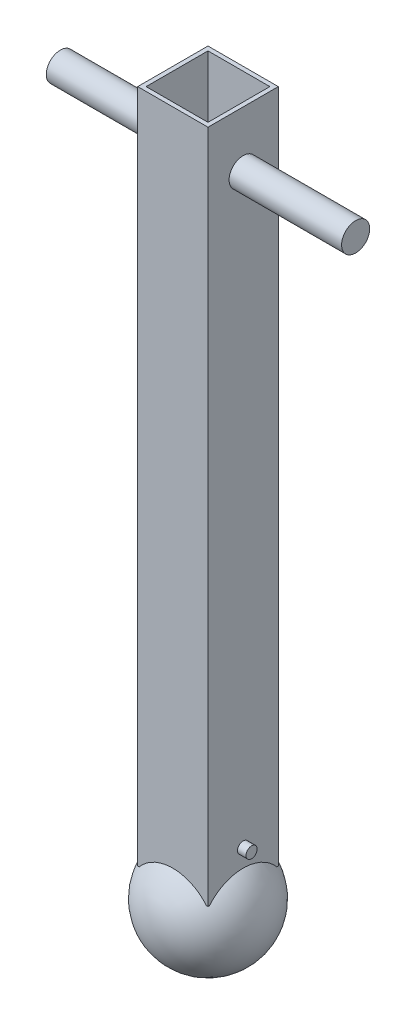
ISO-10303-21;
HEADER;
FILE_DESCRIPTION(('STEP AP214'),'2;1');
FILE_NAME('part.step','',(''),(''),'','','');
FILE_SCHEMA(('AUTOMOTIVE_DESIGN { 1 0 10303 214 1 1 1 1 }'));
ENDSEC;
DATA;
#1=APPLICATION_CONTEXT('core data for automotive mechanical design processes');
#2=APPLICATION_PROTOCOL_DEFINITION('international standard','automotive_design',2000,#1);
#3=PRODUCT_CONTEXT('',#1,'mechanical');
#4=PRODUCT('Part','Part','',(#3));
#5=PRODUCT_RELATED_PRODUCT_CATEGORY('part','',(#4));
#6=PRODUCT_DEFINITION_FORMATION('','',#4);
#7=PRODUCT_DEFINITION_CONTEXT('part definition',#1,'design');
#8=PRODUCT_DEFINITION('design','',#6,#7);
#9=PRODUCT_DEFINITION_SHAPE('','',#8);
#10=(LENGTH_UNIT() NAMED_UNIT(*) SI_UNIT(.MILLI.,.METRE.));
#11=(NAMED_UNIT(*) PLANE_ANGLE_UNIT() SI_UNIT($,.RADIAN.));
#12=(NAMED_UNIT(*) SI_UNIT($,.STERADIAN.) SOLID_ANGLE_UNIT());
#13=UNCERTAINTY_MEASURE_WITH_UNIT(LENGTH_MEASURE(1.E-05),#10,'distance_accuracy_value','');
#14=(GEOMETRIC_REPRESENTATION_CONTEXT(3) GLOBAL_UNCERTAINTY_ASSIGNED_CONTEXT((#13)) GLOBAL_UNIT_ASSIGNED_CONTEXT((#10,
#11,#12)) REPRESENTATION_CONTEXT('',''));
#15=CARTESIAN_POINT('',(0.,0.,0.));
#16=DIRECTION('',(0.,0.,1.));
#17=DIRECTION('',(1.,0.,0.));
#18=AXIS2_PLACEMENT_3D('',#15,#16,#17);
#19=CARTESIAN_POINT('',(15.5,12.,0.));
#20=DIRECTION('',(-1.,0.,0.));
#21=DIRECTION('',(0.,0.,1.));
#22=AXIS2_PLACEMENT_3D('',#19,#20,#21);
#23=CYLINDRICAL_SURFACE('',#22,1.99);
#24=CARTESIAN_POINT('',(15.5,12.,0.));
#25=DIRECTION('',(-1.,0.,0.));
#26=DIRECTION('',(0.,0.,1.));
#27=AXIS2_PLACEMENT_3D('',#24,#25,#26);
#28=CIRCLE('',#27,1.99);
#29=CARTESIAN_POINT('',(15.5,12.,1.99));
#30=VERTEX_POINT('',#29);
#31=EDGE_CURVE('E11',#30,#30,#28,.T.);
#32=ORIENTED_EDGE('',*,*,#31,.T.);
#33=EDGE_LOOP('',(#32));
#34=FACE_BOUND('',#33,.T.);
#35=CARTESIAN_POINT('',(-15.5,12.,0.));
#36=DIRECTION('',(-1.,0.,0.));
#37=DIRECTION('',(0.,0.,1.));
#38=AXIS2_PLACEMENT_3D('',#35,#36,#37);
#39=CIRCLE('',#38,1.99);
#40=CARTESIAN_POINT('',(-15.5,12.,1.99));
#41=VERTEX_POINT('',#40);
#42=EDGE_CURVE('E49',#41,#41,#39,.T.);
#43=ORIENTED_EDGE('',*,*,#42,.F.);
#44=EDGE_LOOP('',(#43));
#45=FACE_BOUND('',#44,.T.);
#46=ADVANCED_FACE('F43',(#34,#45),#23,.T.);
#47=CARTESIAN_POINT('',(15.5,12.,0.));
#48=DIRECTION('',(-1.,0.,0.));
#49=DIRECTION('',(0.,0.,1.));
#50=AXIS2_PLACEMENT_3D('',#47,#48,#49);
#51=PLANE('',#50);
#52=ORIENTED_EDGE('',*,*,#31,.F.);
#53=EDGE_LOOP('',(#52));
#54=FACE_BOUND('',#53,.T.);
#55=ADVANCED_FACE('F58',(#54),#51,.F.);
#56=CARTESIAN_POINT('',(-15.5,12.,0.));
#57=DIRECTION('',(-1.,0.,0.));
#58=DIRECTION('',(0.,0.,1.));
#59=AXIS2_PLACEMENT_3D('',#56,#57,#58);
#60=PLANE('',#59);
#61=ORIENTED_EDGE('',*,*,#42,.T.);
#62=EDGE_LOOP('',(#61));
#63=FACE_BOUND('',#62,.T.);
#64=ADVANCED_FACE('F55',(#63),#60,.T.);
#65=CLOSED_SHELL('',(#46,#55,#64));
#66=MANIFOLD_SOLID_BREP('B2',#65);
#67=CARTESIAN_POINT('',(0.,0.,0.));
#68=DIRECTION('',(0.,1.,0.));
#69=DIRECTION('',(0.,0.,1.));
#70=AXIS2_PLACEMENT_3D('',#67,#68,#69);
#71=PLANE('',#70);
#72=DIRECTION('',(1.,0.,0.));
#73=VECTOR('',#72,1.);
#74=CARTESIAN_POINT('',(-12.5,0.,12.5));
#75=LINE('',#74,#73);
#76=CARTESIAN_POINT('',(11.9895788082818,0.,12.5));
#77=VERTEX_POINT('',#76);
#78=CARTESIAN_POINT('',(12.5,0.,12.5));
#79=VERTEX_POINT('',#78);
#80=EDGE_CURVE('E241',#77,#79,#75,.T.);
#81=ORIENTED_EDGE('',*,*,#80,.F.);
#82=CARTESIAN_POINT('',(0.,0.,0.));
#83=DIRECTION('',(0.,1.,0.));
#84=DIRECTION('',(0.,0.,1.));
#85=AXIS2_PLACEMENT_3D('',#82,#83,#84);
#86=CIRCLE('',#85,17.3205080756888);
#87=CARTESIAN_POINT('',(12.5,0.,11.9895788082818));
#88=VERTEX_POINT('',#87);
#89=EDGE_CURVE('E207',#77,#88,#86,.T.);
#90=ORIENTED_EDGE('',*,*,#89,.T.);
#91=DIRECTION('',(0.,0.,-1.));
#92=VECTOR('',#91,1.);
#93=CARTESIAN_POINT('',(12.5,0.,-12.5));
#94=LINE('',#93,#92);
#95=EDGE_CURVE('E230',#79,#88,#94,.T.);
#96=ORIENTED_EDGE('',*,*,#95,.F.);
#97=EDGE_LOOP('',(#81,#90,#96));
#98=FACE_BOUND('',#97,.T.);
#99=ADVANCED_FACE('F87',(#98),#71,.F.);
#100=CARTESIAN_POINT('',(12.5,0.,-11.9895788082818));
#101=VERTEX_POINT('',#100);
#102=CARTESIAN_POINT('',(12.5,0.,-12.5));
#103=VERTEX_POINT('',#102);
#104=EDGE_CURVE('E218',#101,#103,#94,.T.);
#105=ORIENTED_EDGE('',*,*,#104,.F.);
#106=CARTESIAN_POINT('',(11.9895788082818,0.,-12.5));
#107=VERTEX_POINT('',#106);
#108=EDGE_CURVE('E200',#101,#107,#86,.T.);
#109=ORIENTED_EDGE('',*,*,#108,.T.);
#110=DIRECTION('',(-1.,0.,0.));
#111=VECTOR('',#110,1.);
#112=CARTESIAN_POINT('',(-12.5,0.,-12.5));
#113=LINE('',#112,#111);
#114=EDGE_CURVE('E234',#103,#107,#113,.T.);
#115=ORIENTED_EDGE('',*,*,#114,.F.);
#116=EDGE_LOOP('',(#105,#109,#115));
#117=FACE_BOUND('',#116,.T.);
#118=ADVANCED_FACE('F339',(#117),#71,.F.);
#119=CARTESIAN_POINT('',(-11.9895788082818,0.,-12.5));
#120=VERTEX_POINT('',#119);
#121=CARTESIAN_POINT('',(-12.5,0.,-12.5));
#122=VERTEX_POINT('',#121);
#123=EDGE_CURVE('E233',#120,#122,#113,.T.);
#124=ORIENTED_EDGE('',*,*,#123,.F.);
#125=CARTESIAN_POINT('',(-12.5,0.,-11.9895788082818));
#126=VERTEX_POINT('',#125);
#127=EDGE_CURVE('E274',#120,#126,#86,.T.);
#128=ORIENTED_EDGE('',*,*,#127,.T.);
#129=DIRECTION('',(0.,0.,1.));
#130=VECTOR('',#129,1.);
#131=CARTESIAN_POINT('',(-12.5,0.,-12.5));
#132=LINE('',#131,#130);
#133=EDGE_CURVE('E238',#122,#126,#132,.T.);
#134=ORIENTED_EDGE('',*,*,#133,.F.);
#135=EDGE_LOOP('',(#124,#128,#134));
#136=FACE_BOUND('',#135,.T.);
#137=ADVANCED_FACE('F324',(#136),#71,.F.);
#138=CARTESIAN_POINT('',(12.5,240.,-12.5));
#139=DIRECTION('',(-1.,0.,0.));
#140=DIRECTION('',(0.,0.,1.));
#141=AXIS2_PLACEMENT_3D('',#138,#139,#140);
#142=PLANE('',#141);
#143=CARTESIAN_POINT('',(12.5,220.,0.));
#144=DIRECTION('',(-1.,0.,0.));
#145=DIRECTION('',(0.,0.,1.));
#146=AXIS2_PLACEMENT_3D('',#143,#144,#145);
#147=CIRCLE('',#146,5.00000000000002);
#148=CARTESIAN_POINT('',(12.5,220.,5.));
#149=VERTEX_POINT('',#148);
#150=EDGE_CURVE('E267',#149,#149,#147,.T.);
#151=ORIENTED_EDGE('',*,*,#150,.T.);
#152=EDGE_LOOP('',(#151));
#153=FACE_BOUND('',#152,.T.);
#154=CARTESIAN_POINT('',(12.5,12.,0.));
#155=DIRECTION('',(1.,0.,0.));
#156=DIRECTION('',(0.,0.,-1.));
#157=AXIS2_PLACEMENT_3D('',#154,#155,#156);
#158=CIRCLE('',#157,2.);
#159=CARTESIAN_POINT('',(12.5,12.,-2.));
#160=VERTEX_POINT('',#159);
#161=EDGE_CURVE('E262',#160,#160,#158,.T.);
#162=ORIENTED_EDGE('',*,*,#161,.F.);
#163=EDGE_LOOP('',(#162));
#164=FACE_BOUND('',#163,.T.);
#165=ORIENTED_EDGE('',*,*,#95,.T.);
#166=CARTESIAN_POINT('',(12.5,-10.,0.));
#167=DIRECTION('',(-1.,0.,0.));
#168=DIRECTION('',(0.,0.,1.));
#169=AXIS2_PLACEMENT_3D('',#166,#167,#168);
#170=CIRCLE('',#169,15.612494995996);
#171=EDGE_CURVE('E205',#88,#101,#170,.T.);
#172=ORIENTED_EDGE('',*,*,#171,.T.);
#173=ORIENTED_EDGE('',*,*,#104,.T.);
#174=DIRECTION('',(0.,-1.,0.));
#175=VECTOR('',#174,1.);
#176=CARTESIAN_POINT('',(12.5,240.,-12.5));
#177=LINE('',#176,#175);
#178=CARTESIAN_POINT('',(12.5,240.,-12.5));
#179=VERTEX_POINT('',#178);
#180=EDGE_CURVE('E96',#179,#103,#177,.T.);
#181=ORIENTED_EDGE('',*,*,#180,.F.);
#182=DIRECTION('',(0.,0.,-1.));
#183=VECTOR('',#182,1.);
#184=CARTESIAN_POINT('',(12.5,240.,-12.5));
#185=LINE('',#184,#183);
#186=CARTESIAN_POINT('',(12.5,240.,12.5));
#187=VERTEX_POINT('',#186);
#188=EDGE_CURVE('E219',#187,#179,#185,.T.);
#189=ORIENTED_EDGE('',*,*,#188,.F.);
#190=DIRECTION('',(0.,-1.,0.));
#191=VECTOR('',#190,1.);
#192=CARTESIAN_POINT('',(12.5,240.,12.5));
#193=LINE('',#192,#191);
#194=EDGE_CURVE('E229',#187,#79,#193,.T.);
#195=ORIENTED_EDGE('',*,*,#194,.T.);
#196=EDGE_LOOP('',(#165,#172,#173,#181,#189,#195));
#197=FACE_BOUND('',#196,.T.);
#198=ADVANCED_FACE('F89',(#153,#164,#197),#142,.F.);
#199=CARTESIAN_POINT('',(-12.5,240.,-12.5));
#200=DIRECTION('',(0.,0.,1.));
#201=DIRECTION('',(1.,0.,0.));
#202=AXIS2_PLACEMENT_3D('',#199,#200,#201);
#203=PLANE('',#202);
#204=ORIENTED_EDGE('',*,*,#114,.T.);
#205=CARTESIAN_POINT('',(0.,-10.,-12.5));
#206=DIRECTION('',(0.,0.,1.));
#207=DIRECTION('',(1.,0.,0.));
#208=AXIS2_PLACEMENT_3D('',#205,#206,#207);
#209=CIRCLE('',#208,15.612494995996);
#210=EDGE_CURVE('E279',#107,#120,#209,.T.);
#211=ORIENTED_EDGE('',*,*,#210,.T.);
#212=ORIENTED_EDGE('',*,*,#123,.T.);
#213=DIRECTION('',(0.,-1.,0.));
#214=VECTOR('',#213,1.);
#215=CARTESIAN_POINT('',(-12.5,240.,-12.5));
#216=LINE('',#215,#214);
#217=CARTESIAN_POINT('',(-12.5,240.,-12.5));
#218=VERTEX_POINT('',#217);
#219=EDGE_CURVE('E249',#218,#122,#216,.T.);
#220=ORIENTED_EDGE('',*,*,#219,.F.);
#221=DIRECTION('',(-1.,0.,0.));
#222=VECTOR('',#221,1.);
#223=CARTESIAN_POINT('',(-12.5,240.,-12.5));
#224=LINE('',#223,#222);
#225=EDGE_CURVE('E222',#179,#218,#224,.T.);
#226=ORIENTED_EDGE('',*,*,#225,.F.);
#227=ORIENTED_EDGE('',*,*,#180,.T.);
#228=EDGE_LOOP('',(#204,#211,#212,#220,#226,#227));
#229=FACE_BOUND('',#228,.T.);
#230=ADVANCED_FACE('F308',(#229),#203,.F.);
#231=CARTESIAN_POINT('',(-12.5,240.,-12.5));
#232=DIRECTION('',(1.,0.,0.));
#233=DIRECTION('',(0.,0.,-1.));
#234=AXIS2_PLACEMENT_3D('',#231,#232,#233);
#235=PLANE('',#234);
#236=CARTESIAN_POINT('',(-12.5,220.,0.));
#237=DIRECTION('',(1.,0.,0.));
#238=DIRECTION('',(0.,0.,-1.));
#239=AXIS2_PLACEMENT_3D('',#236,#237,#238);
#240=CIRCLE('',#239,5.00000000000002);
#241=CARTESIAN_POINT('',(-12.5,220.,-5.00000000000003));
#242=VERTEX_POINT('',#241);
#243=EDGE_CURVE('E399',#242,#242,#240,.T.);
#244=ORIENTED_EDGE('',*,*,#243,.T.);
#245=EDGE_LOOP('',(#244));
#246=FACE_BOUND('',#245,.T.);
#247=CARTESIAN_POINT('',(-12.5,12.,0.));
#248=DIRECTION('',(1.,0.,0.));
#249=DIRECTION('',(0.,0.,-1.));
#250=AXIS2_PLACEMENT_3D('',#247,#248,#249);
#251=CIRCLE('',#250,2.);
#252=CARTESIAN_POINT('',(-12.5,12.,-2.));
#253=VERTEX_POINT('',#252);
#254=EDGE_CURVE('E256',#253,#253,#251,.T.);
#255=ORIENTED_EDGE('',*,*,#254,.T.);
#256=EDGE_LOOP('',(#255));
#257=FACE_BOUND('',#256,.T.);
#258=ORIENTED_EDGE('',*,*,#133,.T.);
#259=CARTESIAN_POINT('',(-12.5,-10.,0.));
#260=DIRECTION('',(1.,0.,0.));
#261=DIRECTION('',(0.,0.,-1.));
#262=AXIS2_PLACEMENT_3D('',#259,#260,#261);
#263=CIRCLE('',#262,15.612494995996);
#264=CARTESIAN_POINT('',(-12.5,0.,11.9895788082818));
#265=VERTEX_POINT('',#264);
#266=EDGE_CURVE('E276',#126,#265,#263,.T.);
#267=ORIENTED_EDGE('',*,*,#266,.T.);
#268=CARTESIAN_POINT('',(-12.5,0.,12.5));
#269=VERTEX_POINT('',#268);
#270=EDGE_CURVE('E237',#265,#269,#132,.T.);
#271=ORIENTED_EDGE('',*,*,#270,.T.);
#272=DIRECTION('',(0.,-1.,0.));
#273=VECTOR('',#272,1.);
#274=CARTESIAN_POINT('',(-12.5,240.,12.5));
#275=LINE('',#274,#273);
#276=CARTESIAN_POINT('',(-12.5,240.,12.5));
#277=VERTEX_POINT('',#276);
#278=EDGE_CURVE('E246',#277,#269,#275,.T.);
#279=ORIENTED_EDGE('',*,*,#278,.F.);
#280=DIRECTION('',(0.,0.,1.));
#281=VECTOR('',#280,1.);
#282=CARTESIAN_POINT('',(-12.5,240.,-12.5));
#283=LINE('',#282,#281);
#284=EDGE_CURVE('E225',#218,#277,#283,.T.);
#285=ORIENTED_EDGE('',*,*,#284,.F.);
#286=ORIENTED_EDGE('',*,*,#219,.T.);
#287=EDGE_LOOP('',(#258,#267,#271,#279,#285,#286));
#288=FACE_BOUND('',#287,.T.);
#289=ADVANCED_FACE('F314',(#246,#257,#288),#235,.F.);
#290=CARTESIAN_POINT('',(-12.5,240.,12.5));
#291=DIRECTION('',(0.,0.,-1.));
#292=DIRECTION('',(-1.,0.,0.));
#293=AXIS2_PLACEMENT_3D('',#290,#291,#292);
#294=PLANE('',#293);
#295=CARTESIAN_POINT('',(-11.9895788082818,0.,12.5));
#296=VERTEX_POINT('',#295);
#297=EDGE_CURVE('E223',#269,#296,#75,.T.);
#298=ORIENTED_EDGE('',*,*,#297,.T.);
#299=CARTESIAN_POINT('',(0.,-10.,12.5));
#300=DIRECTION('',(0.,0.,-1.));
#301=DIRECTION('',(-1.,0.,0.));
#302=AXIS2_PLACEMENT_3D('',#299,#300,#301);
#303=CIRCLE('',#302,15.612494995996);
#304=EDGE_CURVE('E107',#296,#77,#303,.T.);
#305=ORIENTED_EDGE('',*,*,#304,.T.);
#306=ORIENTED_EDGE('',*,*,#80,.T.);
#307=ORIENTED_EDGE('',*,*,#194,.F.);
#308=DIRECTION('',(1.,0.,0.));
#309=VECTOR('',#308,1.);
#310=CARTESIAN_POINT('',(-12.5,240.,12.5));
#311=LINE('',#310,#309);
#312=EDGE_CURVE('E227',#277,#187,#311,.T.);
#313=ORIENTED_EDGE('',*,*,#312,.F.);
#314=ORIENTED_EDGE('',*,*,#278,.T.);
#315=EDGE_LOOP('',(#298,#305,#306,#307,#313,#314));
#316=FACE_BOUND('',#315,.T.);
#317=ADVANCED_FACE('F297',(#316),#294,.F.);
#318=CARTESIAN_POINT('',(0.,240.,0.));
#319=DIRECTION('',(0.,1.,0.));
#320=DIRECTION('',(0.,0.,1.));
#321=AXIS2_PLACEMENT_3D('',#318,#319,#320);
#322=PLANE('',#321);
#323=DIRECTION('',(0.,0.,-1.));
#324=VECTOR('',#323,1.);
#325=CARTESIAN_POINT('',(11.,240.,0.));
#326=LINE('',#325,#324);
#327=CARTESIAN_POINT('',(11.,240.,11.));
#328=VERTEX_POINT('',#327);
#329=CARTESIAN_POINT('',(11.,240.,-11.));
#330=VERTEX_POINT('',#329);
#331=EDGE_CURVE('E216',#328,#330,#326,.T.);
#332=ORIENTED_EDGE('',*,*,#331,.F.);
#333=DIRECTION('',(1.,0.,0.));
#334=VECTOR('',#333,1.);
#335=CARTESIAN_POINT('',(0.,240.,11.));
#336=LINE('',#335,#334);
#337=CARTESIAN_POINT('',(-11.,240.,11.));
#338=VERTEX_POINT('',#337);
#339=EDGE_CURVE('E198',#338,#328,#336,.T.);
#340=ORIENTED_EDGE('',*,*,#339,.F.);
#341=DIRECTION('',(0.,0.,1.));
#342=VECTOR('',#341,1.);
#343=CARTESIAN_POINT('',(-11.,240.,0.));
#344=LINE('',#343,#342);
#345=CARTESIAN_POINT('',(-11.,240.,-11.));
#346=VERTEX_POINT('',#345);
#347=EDGE_CURVE('E211',#346,#338,#344,.T.);
#348=ORIENTED_EDGE('',*,*,#347,.F.);
#349=DIRECTION('',(-1.,0.,0.));
#350=VECTOR('',#349,1.);
#351=CARTESIAN_POINT('',(0.,240.,-11.));
#352=LINE('',#351,#350);
#353=EDGE_CURVE('E214',#330,#346,#352,.T.);
#354=ORIENTED_EDGE('',*,*,#353,.F.);
#355=EDGE_LOOP('',(#332,#340,#348,#354));
#356=FACE_BOUND('',#355,.T.);
#357=ORIENTED_EDGE('',*,*,#188,.T.);
#358=ORIENTED_EDGE('',*,*,#225,.T.);
#359=ORIENTED_EDGE('',*,*,#284,.T.);
#360=ORIENTED_EDGE('',*,*,#312,.T.);
#361=EDGE_LOOP('',(#357,#358,#359,#360));
#362=FACE_BOUND('',#361,.T.);
#363=ADVANCED_FACE('F293',(#356,#362),#322,.T.);
#364=ORIENTED_EDGE('',*,*,#270,.F.);
#365=EDGE_CURVE('E193',#265,#296,#86,.T.);
#366=ORIENTED_EDGE('',*,*,#365,.T.);
#367=ORIENTED_EDGE('',*,*,#297,.F.);
#368=EDGE_LOOP('',(#364,#366,#367));
#369=FACE_BOUND('',#368,.T.);
#370=ADVANCED_FACE('F296',(#369),#71,.F.);
#371=CARTESIAN_POINT('',(11.,300.,11.));
#372=DIRECTION('',(1.,0.,0.));
#373=DIRECTION('',(0.,0.,-1.));
#374=AXIS2_PLACEMENT_3D('',#371,#372,#373);
#375=PLANE('',#374);
#376=CARTESIAN_POINT('',(11.,220.,0.));
#377=DIRECTION('',(1.,0.,0.));
#378=DIRECTION('',(0.,0.,-1.));
#379=AXIS2_PLACEMENT_3D('',#376,#377,#378);
#380=CIRCLE('',#379,5.00000000000002);
#381=CARTESIAN_POINT('',(11.,220.,-5.00000000000003));
#382=VERTEX_POINT('',#381);
#383=EDGE_CURVE('E397',#382,#382,#380,.T.);
#384=ORIENTED_EDGE('',*,*,#383,.T.);
#385=EDGE_LOOP('',(#384));
#386=FACE_BOUND('',#385,.T.);
#387=CARTESIAN_POINT('',(11.,12.,0.));
#388=DIRECTION('',(1.,0.,0.));
#389=DIRECTION('',(0.,0.,-1.));
#390=AXIS2_PLACEMENT_3D('',#387,#388,#389);
#391=CIRCLE('',#390,2.);
#392=CARTESIAN_POINT('',(11.,12.,-2.));
#393=VERTEX_POINT('',#392);
#394=EDGE_CURVE('E255',#393,#393,#391,.T.);
#395=ORIENTED_EDGE('',*,*,#394,.T.);
#396=EDGE_LOOP('',(#395));
#397=FACE_BOUND('',#396,.T.);
#398=DIRECTION('',(0.,-1.,0.));
#399=VECTOR('',#398,1.);
#400=CARTESIAN_POINT('',(11.,300.,-11.));
#401=LINE('',#400,#399);
#402=CARTESIAN_POINT('',(11.,2.56980508997654,-11.));
#403=VERTEX_POINT('',#402);
#404=EDGE_CURVE('E192',#330,#403,#401,.T.);
#405=ORIENTED_EDGE('',*,*,#404,.T.);
#406=CARTESIAN_POINT('',(11.,-10.,0.));
#407=DIRECTION('',(1.,0.,0.));
#408=DIRECTION('',(0.,0.,-1.));
#409=AXIS2_PLACEMENT_3D('',#406,#407,#408);
#410=CIRCLE('',#409,16.7032930884901);
#411=CARTESIAN_POINT('',(11.,2.56980508997654,11.));
#412=VERTEX_POINT('',#411);
#413=EDGE_CURVE('E178',#403,#412,#410,.T.);
#414=ORIENTED_EDGE('',*,*,#413,.T.);
#415=DIRECTION('',(0.,-1.,0.));
#416=VECTOR('',#415,1.);
#417=CARTESIAN_POINT('',(11.,300.,11.));
#418=LINE('',#417,#416);
#419=EDGE_CURVE('E189',#328,#412,#418,.T.);
#420=ORIENTED_EDGE('',*,*,#419,.F.);
#421=ORIENTED_EDGE('',*,*,#331,.T.);
#422=EDGE_LOOP('',(#405,#414,#420,#421));
#423=FACE_BOUND('',#422,.T.);
#424=ADVANCED_FACE('F188',(#386,#397,#423),#375,.F.);
#425=CARTESIAN_POINT('',(-11.,300.,-11.));
#426=DIRECTION('',(0.,0.,-1.));
#427=DIRECTION('',(-1.,0.,0.));
#428=AXIS2_PLACEMENT_3D('',#425,#426,#427);
#429=PLANE('',#428);
#430=DIRECTION('',(0.,-1.,0.));
#431=VECTOR('',#430,1.);
#432=CARTESIAN_POINT('',(-11.,300.,-11.));
#433=LINE('',#432,#431);
#434=CARTESIAN_POINT('',(-11.,2.56980508997654,-11.));
#435=VERTEX_POINT('',#434);
#436=EDGE_CURVE('E202',#346,#435,#433,.T.);
#437=ORIENTED_EDGE('',*,*,#436,.T.);
#438=CARTESIAN_POINT('',(0.,-10.,-11.));
#439=DIRECTION('',(0.,0.,-1.));
#440=DIRECTION('',(-1.,0.,0.));
#441=AXIS2_PLACEMENT_3D('',#438,#439,#440);
#442=CIRCLE('',#441,16.7032930884901);
#443=EDGE_CURVE('E194',#435,#403,#442,.T.);
#444=ORIENTED_EDGE('',*,*,#443,.T.);
#445=ORIENTED_EDGE('',*,*,#404,.F.);
#446=ORIENTED_EDGE('',*,*,#353,.T.);
#447=EDGE_LOOP('',(#437,#444,#445,#446));
#448=FACE_BOUND('',#447,.T.);
#449=ADVANCED_FACE('F287',(#448),#429,.F.);
#450=CARTESIAN_POINT('',(-11.,300.,11.));
#451=DIRECTION('',(-1.,0.,0.));
#452=DIRECTION('',(0.,0.,1.));
#453=AXIS2_PLACEMENT_3D('',#450,#451,#452);
#454=PLANE('',#453);
#455=CARTESIAN_POINT('',(-11.,220.,0.));
#456=DIRECTION('',(-1.,0.,0.));
#457=DIRECTION('',(0.,0.,1.));
#458=AXIS2_PLACEMENT_3D('',#455,#456,#457);
#459=CIRCLE('',#458,5.00000000000002);
#460=CARTESIAN_POINT('',(-11.,220.,5.));
#461=VERTEX_POINT('',#460);
#462=EDGE_CURVE('E91',#461,#461,#459,.T.);
#463=ORIENTED_EDGE('',*,*,#462,.T.);
#464=EDGE_LOOP('',(#463));
#465=FACE_BOUND('',#464,.T.);
#466=CARTESIAN_POINT('',(-11.,12.,0.));
#467=DIRECTION('',(-1.,0.,0.));
#468=DIRECTION('',(0.,0.,1.));
#469=AXIS2_PLACEMENT_3D('',#466,#467,#468);
#470=CIRCLE('',#469,2.);
#471=CARTESIAN_POINT('',(-11.,12.,2.));
#472=VERTEX_POINT('',#471);
#473=EDGE_CURVE('E253',#472,#472,#470,.T.);
#474=ORIENTED_EDGE('',*,*,#473,.T.);
#475=EDGE_LOOP('',(#474));
#476=FACE_BOUND('',#475,.T.);
#477=DIRECTION('',(0.,-1.,0.));
#478=VECTOR('',#477,1.);
#479=CARTESIAN_POINT('',(-11.,300.,11.));
#480=LINE('',#479,#478);
#481=CARTESIAN_POINT('',(-11.,2.56980508997653,11.));
#482=VERTEX_POINT('',#481);
#483=EDGE_CURVE('E199',#338,#482,#480,.T.);
#484=ORIENTED_EDGE('',*,*,#483,.T.);
#485=CARTESIAN_POINT('',(-11.,-10.,0.));
#486=DIRECTION('',(-1.,0.,0.));
#487=DIRECTION('',(0.,0.,1.));
#488=AXIS2_PLACEMENT_3D('',#485,#486,#487);
#489=CIRCLE('',#488,16.7032930884901);
#490=EDGE_CURVE('E181',#482,#435,#489,.T.);
#491=ORIENTED_EDGE('',*,*,#490,.T.);
#492=ORIENTED_EDGE('',*,*,#436,.F.);
#493=ORIENTED_EDGE('',*,*,#347,.T.);
#494=EDGE_LOOP('',(#484,#491,#492,#493));
#495=FACE_BOUND('',#494,.T.);
#496=ADVANCED_FACE('F291',(#465,#476,#495),#454,.F.);
#497=CARTESIAN_POINT('',(-11.,300.,11.));
#498=DIRECTION('',(0.,0.,1.));
#499=DIRECTION('',(1.,0.,0.));
#500=AXIS2_PLACEMENT_3D('',#497,#498,#499);
#501=PLANE('',#500);
#502=ORIENTED_EDGE('',*,*,#419,.T.);
#503=CARTESIAN_POINT('',(0.,-10.,11.));
#504=DIRECTION('',(0.,0.,1.));
#505=DIRECTION('',(1.,0.,0.));
#506=AXIS2_PLACEMENT_3D('',#503,#504,#505);
#507=CIRCLE('',#506,16.7032930884901);
#508=EDGE_CURVE('E41',#412,#482,#507,.T.);
#509=ORIENTED_EDGE('',*,*,#508,.T.);
#510=ORIENTED_EDGE('',*,*,#483,.F.);
#511=ORIENTED_EDGE('',*,*,#339,.T.);
#512=EDGE_LOOP('',(#502,#509,#510,#511));
#513=FACE_BOUND('',#512,.T.);
#514=ADVANCED_FACE('F196',(#513),#501,.F.);
#515=CARTESIAN_POINT('',(0.,-10.,0.));
#516=DIRECTION('',(0.,0.,-1.));
#517=DIRECTION('',(-1.,0.,0.));
#518=AXIS2_PLACEMENT_3D('',#515,#516,#517);
#519=SPHERICAL_SURFACE('',#518,20.);
#520=CARTESIAN_POINT('',(0.,10.,0.));
#521=VERTEX_POINT('',#520);
#522=VERTEX_LOOP('',#521);
#523=FACE_BOUND('',#522,.T.);
#524=ORIENTED_EDGE('',*,*,#413,.F.);
#525=ORIENTED_EDGE('',*,*,#443,.F.);
#526=ORIENTED_EDGE('',*,*,#490,.F.);
#527=ORIENTED_EDGE('',*,*,#508,.F.);
#528=EDGE_LOOP('',(#524,#525,#526,#527));
#529=FACE_BOUND('',#528,.T.);
#530=ADVANCED_FACE('F177',(#523,#529),#519,.T.);
#531=ORIENTED_EDGE('',*,*,#108,.F.);
#532=ORIENTED_EDGE('',*,*,#171,.F.);
#533=ORIENTED_EDGE('',*,*,#89,.F.);
#534=ORIENTED_EDGE('',*,*,#304,.F.);
#535=ORIENTED_EDGE('',*,*,#365,.F.);
#536=ORIENTED_EDGE('',*,*,#266,.F.);
#537=ORIENTED_EDGE('',*,*,#127,.F.);
#538=ORIENTED_EDGE('',*,*,#210,.F.);
#539=EDGE_LOOP('',(#531,#532,#533,#534,#535,#536,#537,#538));
#540=FACE_BOUND('',#539,.T.);
#541=ADVANCED_FACE('F326',(#540),#519,.T.);
#542=CARTESIAN_POINT('',(-12.5,12.,0.));
#543=DIRECTION('',(1.,0.,0.));
#544=DIRECTION('',(0.,0.,-1.));
#545=AXIS2_PLACEMENT_3D('',#542,#543,#544);
#546=CYLINDRICAL_SURFACE('',#545,2.);
#547=ORIENTED_EDGE('',*,*,#254,.F.);
#548=EDGE_LOOP('',(#547));
#549=FACE_BOUND('',#548,.T.);
#550=ORIENTED_EDGE('',*,*,#473,.F.);
#551=EDGE_LOOP('',(#550));
#552=FACE_BOUND('',#551,.T.);
#553=ADVANCED_FACE('F328',(#549,#552),#546,.F.);
#554=ORIENTED_EDGE('',*,*,#161,.T.);
#555=EDGE_LOOP('',(#554));
#556=FACE_BOUND('',#555,.T.);
#557=ORIENTED_EDGE('',*,*,#394,.F.);
#558=EDGE_LOOP('',(#557));
#559=FACE_BOUND('',#558,.T.);
#560=ADVANCED_FACE('F334',(#556,#559),#546,.F.);
#561=CARTESIAN_POINT('',(-52.5,220.,0.));
#562=DIRECTION('',(1.,0.,0.));
#563=DIRECTION('',(0.,0.,-1.));
#564=AXIS2_PLACEMENT_3D('',#561,#562,#563);
#565=CYLINDRICAL_SURFACE('',#564,5.00000000000002);
#566=ORIENTED_EDGE('',*,*,#462,.F.);
#567=EDGE_LOOP('',(#566));
#568=FACE_BOUND('',#567,.T.);
#569=ORIENTED_EDGE('',*,*,#383,.F.);
#570=EDGE_LOOP('',(#569));
#571=FACE_BOUND('',#570,.T.);
#572=ADVANCED_FACE('F367',(#568,#571),#565,.T.);
#573=CARTESIAN_POINT('',(-52.5,220.,0.));
#574=DIRECTION('',(1.,0.,0.));
#575=DIRECTION('',(0.,0.,-1.));
#576=AXIS2_PLACEMENT_3D('',#573,#574,#575);
#577=PLANE('',#576);
#578=CARTESIAN_POINT('',(-52.5,220.,0.));
#579=DIRECTION('',(1.,0.,0.));
#580=DIRECTION('',(0.,0.,-1.));
#581=AXIS2_PLACEMENT_3D('',#578,#579,#580);
#582=CIRCLE('',#581,5.00000000000002);
#583=CARTESIAN_POINT('',(-52.5,220.,-5.00000000000003));
#584=VERTEX_POINT('',#583);
#585=EDGE_CURVE('E392',#584,#584,#582,.T.);
#586=ORIENTED_EDGE('',*,*,#585,.F.);
#587=EDGE_LOOP('',(#586));
#588=FACE_BOUND('',#587,.T.);
#589=ADVANCED_FACE('F373',(#588),#577,.F.);
#590=ORIENTED_EDGE('',*,*,#585,.T.);
#591=EDGE_LOOP('',(#590));
#592=FACE_BOUND('',#591,.T.);
#593=ORIENTED_EDGE('',*,*,#243,.F.);
#594=EDGE_LOOP('',(#593));
#595=FACE_BOUND('',#594,.T.);
#596=ADVANCED_FACE('F377',(#592,#595),#565,.T.);
#597=CARTESIAN_POINT('',(52.5,220.,0.));
#598=DIRECTION('',(1.,0.,0.));
#599=DIRECTION('',(0.,0.,-1.));
#600=AXIS2_PLACEMENT_3D('',#597,#598,#599);
#601=CIRCLE('',#600,5.00000000000002);
#602=CARTESIAN_POINT('',(52.5,220.,-5.00000000000003));
#603=VERTEX_POINT('',#602);
#604=EDGE_CURVE('E391',#603,#603,#601,.T.);
#605=ORIENTED_EDGE('',*,*,#604,.F.);
#606=EDGE_LOOP('',(#605));
#607=FACE_BOUND('',#606,.T.);
#608=ORIENTED_EDGE('',*,*,#150,.F.);
#609=EDGE_LOOP('',(#608));
#610=FACE_BOUND('',#609,.T.);
#611=ADVANCED_FACE('F376',(#607,#610),#565,.T.);
#612=CARTESIAN_POINT('',(52.5,220.,0.));
#613=DIRECTION('',(1.,0.,0.));
#614=DIRECTION('',(0.,0.,-1.));
#615=AXIS2_PLACEMENT_3D('',#612,#613,#614);
#616=PLANE('',#615);
#617=ORIENTED_EDGE('',*,*,#604,.T.);
#618=EDGE_LOOP('',(#617));
#619=FACE_BOUND('',#618,.T.);
#620=ADVANCED_FACE('F380',(#619),#616,.T.);
#621=CLOSED_SHELL('',(#99,#118,#137,#198,#230,#289,#317,#363,#370,#424,#449,#496,#514,#530,#541,
#553,#560,#572,#589,#596,#611,#620));
#622=MANIFOLD_SOLID_BREP('B6',#621);
#623=ADVANCED_BREP_SHAPE_REPRESENTATION('',(#18,#66,#622),#14);
#624=SHAPE_DEFINITION_REPRESENTATION(#9,#623);
ENDSEC;
END-ISO-10303-21;
